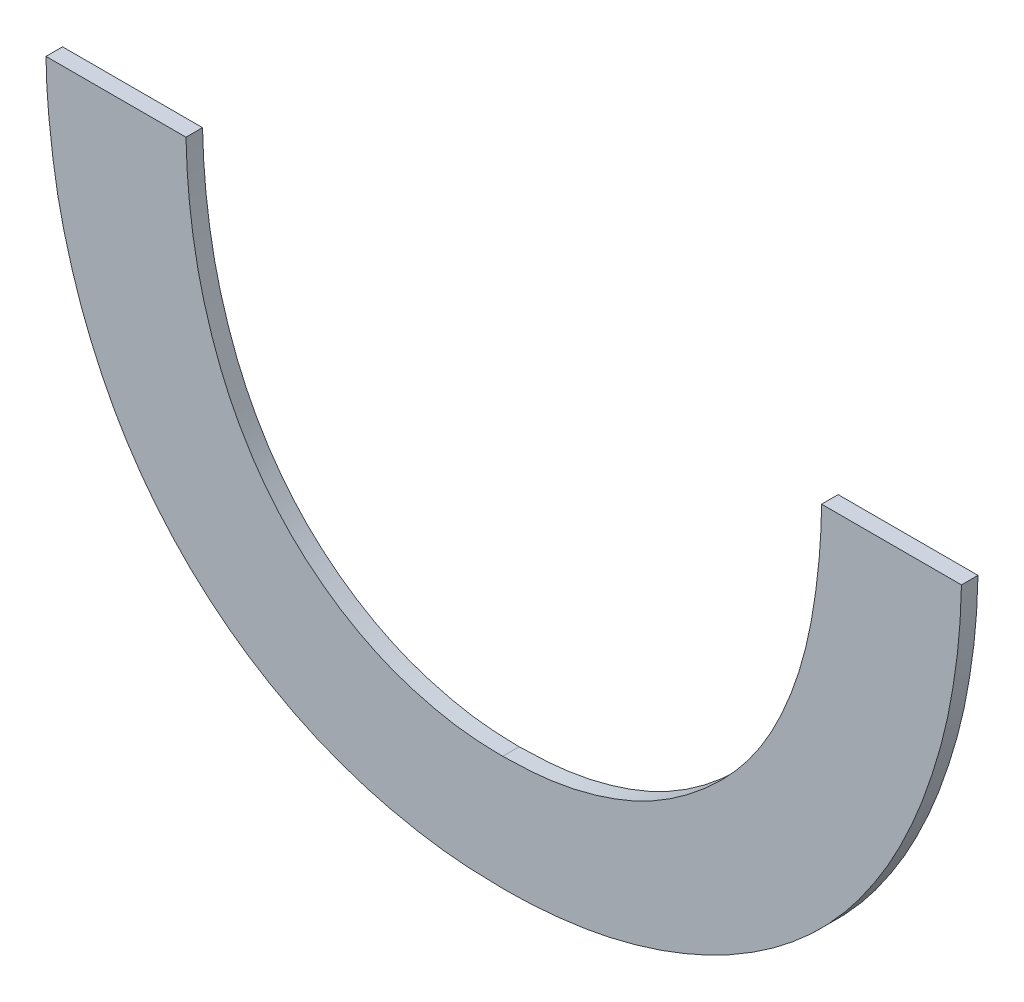
ISO-10303-21;
HEADER;
FILE_DESCRIPTION(('STEP AP214'),'2;1');
FILE_NAME('part.step','',(''),(''),'','','');
FILE_SCHEMA(('AUTOMOTIVE_DESIGN { 1 0 10303 214 1 1 1 1 }'));
ENDSEC;
DATA;
#1=APPLICATION_CONTEXT('core data for automotive mechanical design processes');
#2=APPLICATION_PROTOCOL_DEFINITION('international standard','automotive_design',2000,#1);
#3=PRODUCT_CONTEXT('',#1,'mechanical');
#4=PRODUCT('Part','Part','',(#3));
#5=PRODUCT_RELATED_PRODUCT_CATEGORY('part','',(#4));
#6=PRODUCT_DEFINITION_FORMATION('','',#4);
#7=PRODUCT_DEFINITION_CONTEXT('part definition',#1,'design');
#8=PRODUCT_DEFINITION('design','',#6,#7);
#9=PRODUCT_DEFINITION_SHAPE('','',#8);
#10=(LENGTH_UNIT() NAMED_UNIT(*) SI_UNIT(.MILLI.,.METRE.));
#11=(NAMED_UNIT(*) PLANE_ANGLE_UNIT() SI_UNIT($,.RADIAN.));
#12=(NAMED_UNIT(*) SI_UNIT($,.STERADIAN.) SOLID_ANGLE_UNIT());
#13=UNCERTAINTY_MEASURE_WITH_UNIT(LENGTH_MEASURE(1.E-05),#10,'distance_accuracy_value','');
#14=(GEOMETRIC_REPRESENTATION_CONTEXT(3) GLOBAL_UNCERTAINTY_ASSIGNED_CONTEXT((#13)) GLOBAL_UNIT_ASSIGNED_CONTEXT((#10,
#11,#12)) REPRESENTATION_CONTEXT('',''));
#15=CARTESIAN_POINT('',(0.,0.,0.));
#16=DIRECTION('',(0.,0.,1.));
#17=DIRECTION('',(1.,0.,0.));
#18=AXIS2_PLACEMENT_3D('',#15,#16,#17);
#19=CARTESIAN_POINT('',(-9.23076923077026,-0.0240384615384608,0.5));
#20=CARTESIAN_POINT('',(-9.22742939727225,-0.318596178548193,0.5));
#21=CARTESIAN_POINT('',(-9.22085752955224,-0.898204219862931,0.5));
#22=CARTESIAN_POINT('',(-9.1653706622535,-1.75243061374529,0.5));
#23=CARTESIAN_POINT('',(-9.07649026468492,-2.57679560960675,0.5));
#24=CARTESIAN_POINT('',(-8.94932158905348,-3.37286871339985,0.5));
#25=CARTESIAN_POINT('',(-8.78949163866735,-4.14430321447353,0.5));
#26=CARTESIAN_POINT('',(-8.58385391991951,-4.88531652091432,0.5));
#27=CARTESIAN_POINT('',(-8.34917372585964,-5.60009162053743,0.5));
#28=CARTESIAN_POINT('',(-8.08067290657777,-6.28341110645324,0.5));
#29=CARTESIAN_POINT('',(-7.77443865615712,-6.9344726977673,0.5));
#30=CARTESIAN_POINT('',(-7.42994849622641,-7.5468445705967,0.5));
#31=CARTESIAN_POINT('',(-7.06050982582367,-8.12735923006175,0.5));
#32=CARTESIAN_POINT('',(-6.64569797559103,-8.66215061305466,0.5));
#33=CARTESIAN_POINT('',(-6.21086039709496,-9.17029672832401,0.5));
#34=CARTESIAN_POINT('',(-5.73202634110637,-9.63424647654224,0.5));
#35=CARTESIAN_POINT('',(-5.22047211382301,-10.0601986348144,0.5));
#36=CARTESIAN_POINT('',(-4.68008112348559,-10.4526659688959,0.5));
#37=CARTESIAN_POINT('',(-4.11202692213373,-10.7976895862886,0.5));
#38=CARTESIAN_POINT('',(-3.52653894607339,-11.1009202144643,0.5));
#39=CARTESIAN_POINT('',(-2.92219963723877,-11.3558977985499,0.5));
#40=CARTESIAN_POINT('',(-2.29928965525818,-11.5559333068254,0.5));
#41=CARTESIAN_POINT('',(-1.6616766447291,-11.7211398888773,0.5));
#42=CARTESIAN_POINT('',(-1.00762991408437,-11.8434152273746,0.5));
#43=CARTESIAN_POINT('',(-0.333822092838743,-11.9073323496162,0.5));
#44=CARTESIAN_POINT('',(0.12007538581159,-11.9178051425562,0.5));
#45=CARTESIAN_POINT('',(0.348557692306663,-11.9230769230769,0.5));
#46=B_SPLINE_CURVE_WITH_KNOTS('',3,(#19,#20,#21,#22,#23,#24,#25,#26,#27,#28,#29,#30,#31,#32,#33,
#34,#35,#36,#37,#38,#39,#40,#41,#42,#43,#44,#45),.UNSPECIFIED.,.F.,.F.,(4,1,1,1,1,1,1,1,1,1,1,1,
1,1,1,1,1,1,1,1,1,1,1,1,4),(0.,0.0514610171400537,0.101261035193402,0.149497872648758,
0.196279154737119,0.242065258148012,0.287067412815792,0.330564939776076,0.373461259409084,
0.41526416772885,0.456160527693009,0.496158888911208,0.535360682937057,0.57431168322327,
0.612923114330565,0.651686534601259,0.69054306991343,0.729500359720156,0.767695513004834,
0.805657428454389,0.843953476887775,0.881899254124872,0.920686368902722,0.960075210323947,1.),.UNSPECIFIED.);
#47=DIRECTION('',(0.,0.,1.));
#48=VECTOR('',#47,1.);
#49=SURFACE_OF_LINEAR_EXTRUSION('',#46,#48);
#50=CARTESIAN_POINT('',(-9.22412025572812,-0.5,0.5));
#51=VERTEX_POINT('',#50);
#52=CARTESIAN_POINT('',(0.348557692306663,-11.9230769230769,0.5));
#53=VERTEX_POINT('',#52);
#54=EDGE_CURVE('E99',#51,#53,#46,.T.);
#55=ORIENTED_EDGE('',*,*,#54,.F.);
#56=DIRECTION('',(0.,0.,1.));
#57=VECTOR('',#56,1.);
#58=CARTESIAN_POINT('',(-9.22412025572812,-0.5,0.5));
#59=LINE('',#58,#57);
#60=CARTESIAN_POINT('',(-9.22412025572813,-0.499999999999543,1.));
#61=VERTEX_POINT('',#60);
#62=EDGE_CURVE('E11',#51,#61,#59,.T.);
#63=ORIENTED_EDGE('',*,*,#62,.T.);
#64=CARTESIAN_POINT('',(-9.23076923077026,-0.0240384615384608,1.));
#65=CARTESIAN_POINT('',(-9.22742939727225,-0.318596178548193,1.));
#66=CARTESIAN_POINT('',(-9.22085752955224,-0.898204219862931,1.));
#67=CARTESIAN_POINT('',(-9.1653706622535,-1.75243061374529,1.));
#68=CARTESIAN_POINT('',(-9.07649026468492,-2.57679560960675,1.));
#69=CARTESIAN_POINT('',(-8.94932158905348,-3.37286871339985,1.));
#70=CARTESIAN_POINT('',(-8.78949163866735,-4.14430321447353,1.));
#71=CARTESIAN_POINT('',(-8.58385391991951,-4.88531652091432,1.));
#72=CARTESIAN_POINT('',(-8.34917372585964,-5.60009162053743,1.));
#73=CARTESIAN_POINT('',(-8.08067290657777,-6.28341110645324,1.));
#74=CARTESIAN_POINT('',(-7.77443865615712,-6.9344726977673,1.));
#75=CARTESIAN_POINT('',(-7.42994849622641,-7.5468445705967,1.));
#76=CARTESIAN_POINT('',(-7.06050982582367,-8.12735923006175,1.));
#77=CARTESIAN_POINT('',(-6.64569797559103,-8.66215061305466,1.));
#78=CARTESIAN_POINT('',(-6.21086039709496,-9.17029672832401,1.));
#79=CARTESIAN_POINT('',(-5.73202634110637,-9.63424647654224,1.));
#80=CARTESIAN_POINT('',(-5.22047211382301,-10.0601986348144,1.));
#81=CARTESIAN_POINT('',(-4.68008112348559,-10.4526659688959,1.));
#82=CARTESIAN_POINT('',(-4.11202692213373,-10.7976895862886,1.));
#83=CARTESIAN_POINT('',(-3.52653894607339,-11.1009202144643,1.));
#84=CARTESIAN_POINT('',(-2.92219963723877,-11.3558977985499,1.));
#85=CARTESIAN_POINT('',(-2.29928965525818,-11.5559333068254,1.));
#86=CARTESIAN_POINT('',(-1.6616766447291,-11.7211398888773,1.));
#87=CARTESIAN_POINT('',(-1.00762991408437,-11.8434152273746,1.));
#88=CARTESIAN_POINT('',(-0.333822092838743,-11.9073323496162,1.));
#89=CARTESIAN_POINT('',(0.12007538581159,-11.9178051425562,1.));
#90=CARTESIAN_POINT('',(0.348557692306663,-11.9230769230769,1.));
#91=B_SPLINE_CURVE_WITH_KNOTS('',3,(#64,#65,#66,#67,#68,#69,#70,#71,#72,#73,#74,#75,#76,#77,#78,
#79,#80,#81,#82,#83,#84,#85,#86,#87,#88,#89,#90),.UNSPECIFIED.,.F.,.F.,(4,1,1,1,1,1,1,1,1,1,1,1,
1,1,1,1,1,1,1,1,1,1,1,1,4),(0.,0.0514610171400537,0.101261035193402,0.149497872648758,
0.196279154737119,0.242065258148012,0.287067412815792,0.330564939776076,0.373461259409084,
0.41526416772885,0.456160527693009,0.496158888911208,0.535360682937057,0.57431168322327,
0.612923114330565,0.651686534601259,0.69054306991343,0.729500359720156,0.767695513004834,
0.805657428454389,0.843953476887775,0.881899254124872,0.920686368902722,0.960075210323947,1.),.UNSPECIFIED.);
#92=CARTESIAN_POINT('',(0.348557692306663,-11.9230769230769,1.));
#93=VERTEX_POINT('',#92);
#94=EDGE_CURVE('E114',#61,#93,#91,.T.);
#95=ORIENTED_EDGE('',*,*,#94,.T.);
#96=DIRECTION('',(0.,0.,1.));
#97=VECTOR('',#96,1.);
#98=CARTESIAN_POINT('',(0.348557692306663,-11.9230769230769,0.5));
#99=LINE('',#98,#97);
#100=EDGE_CURVE('E109',#53,#93,#99,.T.);
#101=ORIENTED_EDGE('',*,*,#100,.F.);
#102=EDGE_LOOP('',(#55,#63,#95,#101));
#103=FACE_BOUND('',#102,.T.);
#104=ADVANCED_FACE('F39',(#103),#49,.F.);
#105=CARTESIAN_POINT('',(0.348557692306663,-11.9230769230769,0.5));
#106=CARTESIAN_POINT('',(0.689544281987099,-11.9136181481122,0.5));
#107=CARTESIAN_POINT('',(1.35836680133145,-11.895065390047,0.5));
#108=CARTESIAN_POINT('',(2.33795780345282,-11.7558211005852,0.5));
#109=CARTESIAN_POINT('',(3.27114043788519,-11.5178307436723,0.5));
#110=CARTESIAN_POINT('',(4.16400673314063,-11.1957640248695,0.5));
#111=CARTESIAN_POINT('',(5.0109609035564,-10.7720365551148,0.5));
#112=CARTESIAN_POINT('',(5.80801837020339,-10.2496698802473,0.5));
#113=CARTESIAN_POINT('',(6.56152717279596,-9.63830053528007,0.5));
#114=CARTESIAN_POINT('',(7.27395170428441,-8.94293949093665,0.5));
#115=CARTESIAN_POINT('',(7.91940945592712,-8.14733024995508,0.5));
#116=CARTESIAN_POINT('',(8.47995095622103,-7.25330895789022,0.5));
#117=CARTESIAN_POINT('',(8.9464752777579,-6.26412179138128,0.5));
#118=CARTESIAN_POINT('',(9.33932442225066,-5.19127631489024,0.5));
#119=CARTESIAN_POINT('',(9.63913121728999,-4.02353941243292,0.5));
#120=CARTESIAN_POINT('',(9.84153731983488,-2.76399248032254,0.5));
#121=CARTESIAN_POINT('',(9.98028283744627,-1.41333017930074,0.5));
#122=CARTESIAN_POINT('',(9.99328760391785,-0.481145901775572,0.5));
#123=CARTESIAN_POINT('',(9.99999999999897,0.,0.5));
#124=B_SPLINE_CURVE_WITH_KNOTS('',3,(#105,#106,#107,#108,#109,#110,#111,#112,#113,#114,#115,
#116,#117,#118,#119,#120,#121,#122,#123),.UNSPECIFIED.,.F.,.F.,(4,1,1,1,1,1,1,1,1,1,1,1,1,1,1,1,
4),(0.,0.0590554820081553,0.115833400647239,0.170958554300047,0.225626384614882,
0.279940660175908,0.334608490490743,0.390373210052276,0.447791158502503,0.50675379634902,
0.567407577395925,0.630111179940906,0.695866758700641,0.765048908402566,0.83858205240193,
0.916684301771289,1.),.UNSPECIFIED.);
#125=DIRECTION('',(0.,0.,1.));
#126=VECTOR('',#125,1.);
#127=SURFACE_OF_LINEAR_EXTRUSION('',#124,#126);
#128=CARTESIAN_POINT('',(0.348557692306663,-11.9230769230769,1.));
#129=CARTESIAN_POINT('',(0.689544281987099,-11.9136181481122,1.));
#130=CARTESIAN_POINT('',(1.35836680133145,-11.895065390047,1.));
#131=CARTESIAN_POINT('',(2.33795780345282,-11.7558211005852,1.));
#132=CARTESIAN_POINT('',(3.27114043788519,-11.5178307436723,1.));
#133=CARTESIAN_POINT('',(4.16400673314063,-11.1957640248695,1.));
#134=CARTESIAN_POINT('',(5.0109609035564,-10.7720365551148,1.));
#135=CARTESIAN_POINT('',(5.80801837020339,-10.2496698802473,1.));
#136=CARTESIAN_POINT('',(6.56152717279596,-9.63830053528007,1.));
#137=CARTESIAN_POINT('',(7.27395170428441,-8.94293949093665,1.));
#138=CARTESIAN_POINT('',(7.91940945592712,-8.14733024995508,1.));
#139=CARTESIAN_POINT('',(8.47995095622103,-7.25330895789022,1.));
#140=CARTESIAN_POINT('',(8.9464752777579,-6.26412179138128,1.));
#141=CARTESIAN_POINT('',(9.33932442225066,-5.19127631489024,1.));
#142=CARTESIAN_POINT('',(9.63913121728999,-4.02353941243292,1.));
#143=CARTESIAN_POINT('',(9.84153731983488,-2.76399248032254,1.));
#144=CARTESIAN_POINT('',(9.98028283744627,-1.41333017930074,1.));
#145=CARTESIAN_POINT('',(9.99328760391785,-0.481145901775572,1.));
#146=CARTESIAN_POINT('',(9.99999999999897,0.,1.));
#147=B_SPLINE_CURVE_WITH_KNOTS('',3,(#128,#129,#130,#131,#132,#133,#134,#135,#136,#137,#138,
#139,#140,#141,#142,#143,#144,#145,#146),.UNSPECIFIED.,.F.,.F.,(4,1,1,1,1,1,1,1,1,1,1,1,1,1,1,1,
4),(0.,0.0590554820081553,0.115833400647239,0.170958554300047,0.225626384614882,
0.279940660175908,0.334608490490743,0.390373210052276,0.447791158502503,0.50675379634902,
0.567407577395925,0.630111179940906,0.695866758700641,0.765048908402566,0.83858205240193,
0.916684301771289,1.),.UNSPECIFIED.);
#148=CARTESIAN_POINT('',(9.99211216034469,-0.500000000000002,1.));
#149=VERTEX_POINT('',#148);
#150=EDGE_CURVE('E108',#93,#149,#147,.T.);
#151=ORIENTED_EDGE('',*,*,#150,.T.);
#152=DIRECTION('',(0.,0.,1.));
#153=VECTOR('',#152,1.);
#154=CARTESIAN_POINT('',(9.99211216034469,-0.500000000000002,0.5));
#155=LINE('',#154,#153);
#156=CARTESIAN_POINT('',(9.99211216034471,-0.499999999998766,0.5));
#157=VERTEX_POINT('',#156);
#158=EDGE_CURVE('E179',#149,#157,#155,.F.);
#159=ORIENTED_EDGE('',*,*,#158,.T.);
#160=EDGE_CURVE('E106',#53,#157,#124,.T.);
#161=ORIENTED_EDGE('',*,*,#160,.F.);
#162=ORIENTED_EDGE('',*,*,#100,.T.);
#163=EDGE_LOOP('',(#151,#159,#161,#162));
#164=FACE_BOUND('',#163,.T.);
#165=ADVANCED_FACE('F133',(#164),#127,.F.);
#166=CARTESIAN_POINT('',(-12.3982386079222,6.27826392564542,1.));
#167=DIRECTION('',(0.,0.,1.));
#168=DIRECTION('',(1.,0.,0.));
#169=AXIS2_PLACEMENT_3D('',#166,#167,#168);
#170=PLANE('',#169);
#171=DIRECTION('',(1.,0.,0.));
#172=VECTOR('',#171,1.);
#173=CARTESIAN_POINT('',(-12.3982386079222,-0.5,1.));
#174=LINE('',#173,#172);
#175=CARTESIAN_POINT('',(-13.4566004964542,-0.5,1.));
#176=VERTEX_POINT('',#175);
#177=EDGE_CURVE('E65',#176,#61,#174,.T.);
#178=ORIENTED_EDGE('',*,*,#177,.F.);
#179=CARTESIAN_POINT('',(0.366586538460507,-15.3846153846154,1.));
#180=CARTESIAN_POINT('',(0.0358736126383622,-15.3788619556148,1.));
#181=CARTESIAN_POINT('',(-0.616789055120268,-15.3675075511539,1.));
#182=CARTESIAN_POINT('',(-1.58506812699111,-15.2764728969896,1.));
#183=CARTESIAN_POINT('',(-2.52544937715539,-15.1178667584056,1.));
#184=CARTESIAN_POINT('',(-3.44675871521321,-14.9102060927489,1.));
#185=CARTESIAN_POINT('',(-4.33844005179233,-14.6309359538418,1.));
#186=CARTESIAN_POINT('',(-5.21046674152182,-14.3021923621055,1.));
#187=CARTESIAN_POINT('',(-6.05228056746621,-13.9024170148183,1.));
#188=CARTESIAN_POINT('',(-6.86744829140932,-13.4468983637831,1.));
#189=CARTESIAN_POINT('',(-7.64971452971091,-12.9388481148394,1.));
#190=CARTESIAN_POINT('',(-8.38061912674647,-12.3710637855958,1.));
#191=CARTESIAN_POINT('',(-9.07238083984963,-11.7638328338515,1.));
#192=CARTESIAN_POINT('',(-9.70670294266388,-11.1004929359908,1.));
#193=CARTESIAN_POINT('',(-10.3008521996199,-10.3932007131057,1.));
#194=CARTESIAN_POINT('',(-10.8456197395121,-9.63830968487765,1.));
#195=CARTESIAN_POINT('',(-11.342464195335,-8.83328422721133,1.));
#196=CARTESIAN_POINT('',(-11.7827046042632,-7.98119959687501,1.));
#197=CARTESIAN_POINT('',(-12.1800191240734,-7.09306912400359,1.));
#198=CARTESIAN_POINT('',(-12.5234249000814,-6.17171327334572,1.));
#199=CARTESIAN_POINT('',(-12.808548717773,-5.22100731894925,1.));
#200=CARTESIAN_POINT('',(-13.054179263498,-4.24590958185908,1.));
#201=CARTESIAN_POINT('',(-13.2302743970982,-3.23889886085134,1.));
#202=CARTESIAN_POINT('',(-13.3612102175616,-2.20613420647761,1.));
#203=CARTESIAN_POINT('',(-13.4514409945861,-1.14541982064813,1.));
#204=CARTESIAN_POINT('',(-13.4581445935104,-0.428874914147256,1.));
#205=CARTESIAN_POINT('',(-13.4615384615395,-0.066105769230768,1.));
#206=B_SPLINE_CURVE_WITH_KNOTS('',3,(#179,#180,#181,#182,#183,#184,#185,#186,#187,#188,#189,
#190,#191,#192,#193,#194,#195,#196,#197,#198,#199,#200,#201,#202,#203,#204,#205),.UNSPECIFIED.,
.F.,.F.,(4,1,1,1,1,1,1,1,1,1,1,1,1,1,1,1,1,1,1,1,1,1,1,1,4),(0.,0.0427838926959435,
0.0844341039123777,0.125679147800163,0.166104998919978,0.206520879016592,0.246472039608244,
0.286586799332771,0.326965266163097,0.367221274007164,0.407137951521662,0.44661211671956,
0.486204372918368,0.525760135030759,0.566042832312371,0.606538411851439,0.648039172184453,
0.69003869962302,0.732355305329542,0.775153326152758,0.818401010203018,0.862376464316079,
0.90731814542801,0.953077445911181,1.),.UNSPECIFIED.);
#207=CARTESIAN_POINT('',(0.366586538460507,-15.3846153846154,1.));
#208=VERTEX_POINT('',#207);
#209=EDGE_CURVE('E158',#208,#176,#206,.T.);
#210=ORIENTED_EDGE('',*,*,#209,.F.);
#211=CARTESIAN_POINT('',(14.2307692307682,0.0120192307692321,1.));
#212=CARTESIAN_POINT('',(14.2239359600642,-0.350663649892213,1.));
#213=CARTESIAN_POINT('',(14.2104049861677,-1.06883402591369,1.));
#214=CARTESIAN_POINT('',(14.1346252348453,-2.1347768820939,1.));
#215=CARTESIAN_POINT('',(13.9922029599488,-3.17483773993804,1.));
#216=CARTESIAN_POINT('',(13.810160611367,-4.19352865536421,1.));
#217=CARTESIAN_POINT('',(13.5630120132273,-5.18462940073441,1.));
#218=CARTESIAN_POINT('',(13.2580202235594,-6.1495251851582,1.));
#219=CARTESIAN_POINT('',(12.9153136146364,-7.09467001454664,1.));
#220=CARTESIAN_POINT('',(12.5028712325764,-8.00479077294953,1.));
#221=CARTESIAN_POINT('',(12.0539021134118,-8.88071865236695,1.));
#222=CARTESIAN_POINT('',(11.5426531286626,-9.69953542542057,1.));
#223=CARTESIAN_POINT('',(11.0004012912486,-10.4724871153463,1.));
#224=CARTESIAN_POINT('',(10.3990422420525,-11.1839926569731,1.));
#225=CARTESIAN_POINT('',(9.75703713681709,-11.8476881082123,1.));
#226=CARTESIAN_POINT('',(9.06364733019134,-12.4538697297735,1.));
#227=CARTESIAN_POINT('',(8.32840022527637,-13.0112649087191,1.));
#228=CARTESIAN_POINT('',(7.54699343515304,-13.5047172286884,1.));
#229=CARTESIAN_POINT('',(6.73779325112663,-13.954518977579,1.));
#230=CARTESIAN_POINT('',(5.89355970645838,-14.3275539642778,1.));
#231=CARTESIAN_POINT('',(5.03283009631359,-14.6572600882381,1.));
#232=CARTESIAN_POINT('',(4.14397814962967,-14.9196046204456,1.));
#233=CARTESIAN_POINT('',(3.23387779824388,-15.1332882887659,1.));
#234=CARTESIAN_POINT('',(2.29696100057863,-15.272693765051,1.));
#235=CARTESIAN_POINT('',(1.34012459372923,-15.3683553668255,1.));
#236=CARTESIAN_POINT('',(0.693350557163882,-15.3791577769456,1.));
#237=CARTESIAN_POINT('',(0.366586538460507,-15.3846153846154,1.));
#238=B_SPLINE_CURVE_WITH_KNOTS('',3,(#211,#212,#213,#214,#215,#216,#217,#218,#219,#220,#221,
#222,#223,#224,#225,#226,#227,#228,#229,#230,#231,#232,#233,#234,#235,#236,#237),.UNSPECIFIED.,
.F.,.F.,(4,1,1,1,1,1,1,1,1,1,1,1,1,1,1,1,1,1,1,1,1,1,1,1,4),(0.,0.04672893379693,
0.092530796862592,0.137570170882532,0.181912095837909,0.225788967319153,0.269049794040841,
0.312243599239021,0.355217119116289,0.397694935974335,0.438947799882297,0.479478323509319,
0.519229022076146,0.55883200417945,0.598331424684057,0.637765031057129,0.677569308787914,
0.717299896540064,0.756919692341206,0.796367652177661,0.83596727068472,0.876220783296762,
0.9166986890771,0.957914403514131,1.),.UNSPECIFIED.);
#239=CARTESIAN_POINT('',(14.2201265016649,-0.5,1.));
#240=VERTEX_POINT('',#239);
#241=EDGE_CURVE('E155',#240,#208,#238,.T.);
#242=ORIENTED_EDGE('',*,*,#241,.F.);
#243=EDGE_CURVE('E177',#149,#240,#174,.T.);
#244=ORIENTED_EDGE('',*,*,#243,.F.);
#245=ORIENTED_EDGE('',*,*,#150,.F.);
#246=ORIENTED_EDGE('',*,*,#94,.F.);
#247=EDGE_LOOP('',(#178,#210,#242,#244,#245,#246));
#248=FACE_BOUND('',#247,.T.);
#249=ADVANCED_FACE('F138',(#248),#170,.T.);
#250=CARTESIAN_POINT('',(-12.3982386079222,6.27826392564542,0.5));
#251=DIRECTION('',(0.,0.,1.));
#252=DIRECTION('',(1.,0.,0.));
#253=AXIS2_PLACEMENT_3D('',#250,#251,#252);
#254=PLANE('',#253);
#255=CARTESIAN_POINT('',(0.366586538460507,-15.3846153846154,0.5));
#256=CARTESIAN_POINT('',(0.0358736126383622,-15.3788619556148,0.5));
#257=CARTESIAN_POINT('',(-0.616789055120268,-15.3675075511539,0.5));
#258=CARTESIAN_POINT('',(-1.58506812699111,-15.2764728969896,0.5));
#259=CARTESIAN_POINT('',(-2.52544937715539,-15.1178667584056,0.5));
#260=CARTESIAN_POINT('',(-3.44675871521321,-14.9102060927489,0.5));
#261=CARTESIAN_POINT('',(-4.33844005179233,-14.6309359538418,0.5));
#262=CARTESIAN_POINT('',(-5.21046674152182,-14.3021923621055,0.5));
#263=CARTESIAN_POINT('',(-6.05228056746621,-13.9024170148183,0.5));
#264=CARTESIAN_POINT('',(-6.86744829140932,-13.4468983637831,0.5));
#265=CARTESIAN_POINT('',(-7.64971452971091,-12.9388481148394,0.5));
#266=CARTESIAN_POINT('',(-8.38061912674647,-12.3710637855958,0.5));
#267=CARTESIAN_POINT('',(-9.07238083984963,-11.7638328338515,0.5));
#268=CARTESIAN_POINT('',(-9.70670294266388,-11.1004929359908,0.5));
#269=CARTESIAN_POINT('',(-10.3008521996199,-10.3932007131057,0.5));
#270=CARTESIAN_POINT('',(-10.8456197395121,-9.63830968487765,0.5));
#271=CARTESIAN_POINT('',(-11.342464195335,-8.83328422721133,0.5));
#272=CARTESIAN_POINT('',(-11.7827046042632,-7.98119959687501,0.5));
#273=CARTESIAN_POINT('',(-12.1800191240734,-7.09306912400359,0.5));
#274=CARTESIAN_POINT('',(-12.5234249000814,-6.17171327334572,0.5));
#275=CARTESIAN_POINT('',(-12.808548717773,-5.22100731894925,0.5));
#276=CARTESIAN_POINT('',(-13.054179263498,-4.24590958185908,0.5));
#277=CARTESIAN_POINT('',(-13.2302743970982,-3.23889886085134,0.5));
#278=CARTESIAN_POINT('',(-13.3612102175616,-2.20613420647761,0.5));
#279=CARTESIAN_POINT('',(-13.4514409945861,-1.14541982064813,0.5));
#280=CARTESIAN_POINT('',(-13.4581445935104,-0.428874914147256,0.5));
#281=CARTESIAN_POINT('',(-13.4615384615395,-0.066105769230768,0.5));
#282=B_SPLINE_CURVE_WITH_KNOTS('',3,(#255,#256,#257,#258,#259,#260,#261,#262,#263,#264,#265,
#266,#267,#268,#269,#270,#271,#272,#273,#274,#275,#276,#277,#278,#279,#280,#281),.UNSPECIFIED.,
.F.,.F.,(4,1,1,1,1,1,1,1,1,1,1,1,1,1,1,1,1,1,1,1,1,1,1,1,4),(0.,0.0427838926959435,
0.0844341039123777,0.125679147800163,0.166104998919978,0.206520879016592,0.246472039608244,
0.286586799332771,0.326965266163097,0.367221274007164,0.407137951521662,0.44661211671956,
0.486204372918368,0.525760135030759,0.566042832312371,0.606538411851439,0.648039172184453,
0.69003869962302,0.732355305329542,0.775153326152758,0.818401010203018,0.862376464316079,
0.90731814542801,0.953077445911181,1.),.UNSPECIFIED.);
#283=CARTESIAN_POINT('',(0.366586538460507,-15.3846153846154,0.5));
#284=VERTEX_POINT('',#283);
#285=CARTESIAN_POINT('',(-13.4566004964542,-0.5,0.5));
#286=VERTEX_POINT('',#285);
#287=EDGE_CURVE('E104',#284,#286,#282,.T.);
#288=ORIENTED_EDGE('',*,*,#287,.T.);
#289=DIRECTION('',(1.,0.,0.));
#290=VECTOR('',#289,1.);
#291=CARTESIAN_POINT('',(-12.3982386079222,-0.5,0.5));
#292=LINE('',#291,#290);
#293=EDGE_CURVE('E91',#286,#51,#292,.T.);
#294=ORIENTED_EDGE('',*,*,#293,.T.);
#295=ORIENTED_EDGE('',*,*,#54,.T.);
#296=ORIENTED_EDGE('',*,*,#160,.T.);
#297=CARTESIAN_POINT('',(14.2201265016649,-0.5,0.5));
#298=VERTEX_POINT('',#297);
#299=EDGE_CURVE('E54',#157,#298,#292,.T.);
#300=ORIENTED_EDGE('',*,*,#299,.T.);
#301=CARTESIAN_POINT('',(14.2307692307682,0.0120192307692321,0.5));
#302=CARTESIAN_POINT('',(14.2239359600642,-0.350663649892213,0.5));
#303=CARTESIAN_POINT('',(14.2104049861677,-1.06883402591369,0.5));
#304=CARTESIAN_POINT('',(14.1346252348453,-2.1347768820939,0.5));
#305=CARTESIAN_POINT('',(13.9922029599488,-3.17483773993804,0.5));
#306=CARTESIAN_POINT('',(13.810160611367,-4.19352865536421,0.5));
#307=CARTESIAN_POINT('',(13.5630120132273,-5.18462940073441,0.5));
#308=CARTESIAN_POINT('',(13.2580202235594,-6.1495251851582,0.5));
#309=CARTESIAN_POINT('',(12.9153136146364,-7.09467001454664,0.5));
#310=CARTESIAN_POINT('',(12.5028712325764,-8.00479077294953,0.5));
#311=CARTESIAN_POINT('',(12.0539021134118,-8.88071865236695,0.5));
#312=CARTESIAN_POINT('',(11.5426531286626,-9.69953542542057,0.5));
#313=CARTESIAN_POINT('',(11.0004012912486,-10.4724871153463,0.5));
#314=CARTESIAN_POINT('',(10.3990422420525,-11.1839926569731,0.5));
#315=CARTESIAN_POINT('',(9.75703713681709,-11.8476881082123,0.5));
#316=CARTESIAN_POINT('',(9.06364733019134,-12.4538697297735,0.5));
#317=CARTESIAN_POINT('',(8.32840022527637,-13.0112649087191,0.5));
#318=CARTESIAN_POINT('',(7.54699343515304,-13.5047172286884,0.5));
#319=CARTESIAN_POINT('',(6.73779325112663,-13.954518977579,0.5));
#320=CARTESIAN_POINT('',(5.89355970645838,-14.3275539642778,0.5));
#321=CARTESIAN_POINT('',(5.03283009631359,-14.6572600882381,0.5));
#322=CARTESIAN_POINT('',(4.14397814962967,-14.9196046204456,0.5));
#323=CARTESIAN_POINT('',(3.23387779824388,-15.1332882887659,0.5));
#324=CARTESIAN_POINT('',(2.29696100057863,-15.272693765051,0.5));
#325=CARTESIAN_POINT('',(1.34012459372923,-15.3683553668255,0.5));
#326=CARTESIAN_POINT('',(0.693350557163882,-15.3791577769456,0.5));
#327=CARTESIAN_POINT('',(0.366586538460507,-15.3846153846154,0.5));
#328=B_SPLINE_CURVE_WITH_KNOTS('',3,(#301,#302,#303,#304,#305,#306,#307,#308,#309,#310,#311,
#312,#313,#314,#315,#316,#317,#318,#319,#320,#321,#322,#323,#324,#325,#326,#327),.UNSPECIFIED.,
.F.,.F.,(4,1,1,1,1,1,1,1,1,1,1,1,1,1,1,1,1,1,1,1,1,1,1,1,4),(0.,0.04672893379693,
0.092530796862592,0.137570170882532,0.181912095837909,0.225788967319153,0.269049794040841,
0.312243599239021,0.355217119116289,0.397694935974335,0.438947799882297,0.479478323509319,
0.519229022076146,0.55883200417945,0.598331424684057,0.637765031057129,0.677569308787914,
0.717299896540064,0.756919692341206,0.796367652177661,0.83596727068472,0.876220783296762,
0.9166986890771,0.957914403514131,1.),.UNSPECIFIED.);
#329=EDGE_CURVE('E149',#298,#284,#328,.T.);
#330=ORIENTED_EDGE('',*,*,#329,.T.);
#331=EDGE_LOOP('',(#288,#294,#295,#296,#300,#330));
#332=FACE_BOUND('',#331,.T.);
#333=ADVANCED_FACE('F97',(#332),#254,.F.);
#334=DIRECTION('',(0.,0.,1.));
#335=VECTOR('',#334,1.);
#336=SURFACE_OF_LINEAR_EXTRUSION('',#282,#335);
#337=ORIENTED_EDGE('',*,*,#209,.T.);
#338=DIRECTION('',(0.,0.,1.));
#339=VECTOR('',#338,1.);
#340=CARTESIAN_POINT('',(-13.4566004963036,-0.5,0.5));
#341=LINE('',#340,#339);
#342=EDGE_CURVE('E101',#176,#286,#341,.F.);
#343=ORIENTED_EDGE('',*,*,#342,.T.);
#344=ORIENTED_EDGE('',*,*,#287,.F.);
#345=DIRECTION('',(0.,0.,1.));
#346=VECTOR('',#345,1.);
#347=CARTESIAN_POINT('',(0.366586538460507,-15.3846153846154,0.5));
#348=LINE('',#347,#346);
#349=EDGE_CURVE('E48',#284,#208,#348,.T.);
#350=ORIENTED_EDGE('',*,*,#349,.T.);
#351=EDGE_LOOP('',(#337,#343,#344,#350));
#352=FACE_BOUND('',#351,.T.);
#353=ADVANCED_FACE('F140',(#352),#336,.F.);
#354=DIRECTION('',(0.,0.,1.));
#355=VECTOR('',#354,1.);
#356=SURFACE_OF_LINEAR_EXTRUSION('',#328,#355);
#357=ORIENTED_EDGE('',*,*,#329,.F.);
#358=DIRECTION('',(0.,0.,1.));
#359=VECTOR('',#358,1.);
#360=CARTESIAN_POINT('',(14.220126501665,-0.5,0.5));
#361=LINE('',#360,#359);
#362=EDGE_CURVE('E118',#298,#240,#361,.T.);
#363=ORIENTED_EDGE('',*,*,#362,.T.);
#364=ORIENTED_EDGE('',*,*,#241,.T.);
#365=ORIENTED_EDGE('',*,*,#349,.F.);
#366=EDGE_LOOP('',(#357,#363,#364,#365));
#367=FACE_BOUND('',#366,.T.);
#368=ADVANCED_FACE('F41',(#367),#356,.F.);
#369=CARTESIAN_POINT('',(-17.,-0.5,1.05295982586942));
#370=DIRECTION('',(0.,-1.,0.));
#371=DIRECTION('',(0.,0.,-1.));
#372=AXIS2_PLACEMENT_3D('',#369,#370,#371);
#373=PLANE('',#372);
#374=ORIENTED_EDGE('',*,*,#177,.T.);
#375=ORIENTED_EDGE('',*,*,#62,.F.);
#376=ORIENTED_EDGE('',*,*,#293,.F.);
#377=ORIENTED_EDGE('',*,*,#342,.F.);
#378=EDGE_LOOP('',(#374,#375,#376,#377));
#379=FACE_BOUND('',#378,.T.);
#380=ADVANCED_FACE('F89',(#379),#373,.F.);
#381=ORIENTED_EDGE('',*,*,#299,.F.);
#382=ORIENTED_EDGE('',*,*,#158,.F.);
#383=ORIENTED_EDGE('',*,*,#243,.T.);
#384=ORIENTED_EDGE('',*,*,#362,.F.);
#385=EDGE_LOOP('',(#381,#382,#383,#384));
#386=FACE_BOUND('',#385,.T.);
#387=ADVANCED_FACE('F191',(#386),#373,.F.);
#388=CLOSED_SHELL('',(#104,#165,#249,#333,#353,#368,#380,#387));
#389=MANIFOLD_SOLID_BREP('B2',#388);
#390=ADVANCED_BREP_SHAPE_REPRESENTATION('',(#18,#389),#14);
#391=SHAPE_DEFINITION_REPRESENTATION(#9,#390);
ENDSEC;
END-ISO-10303-21;
